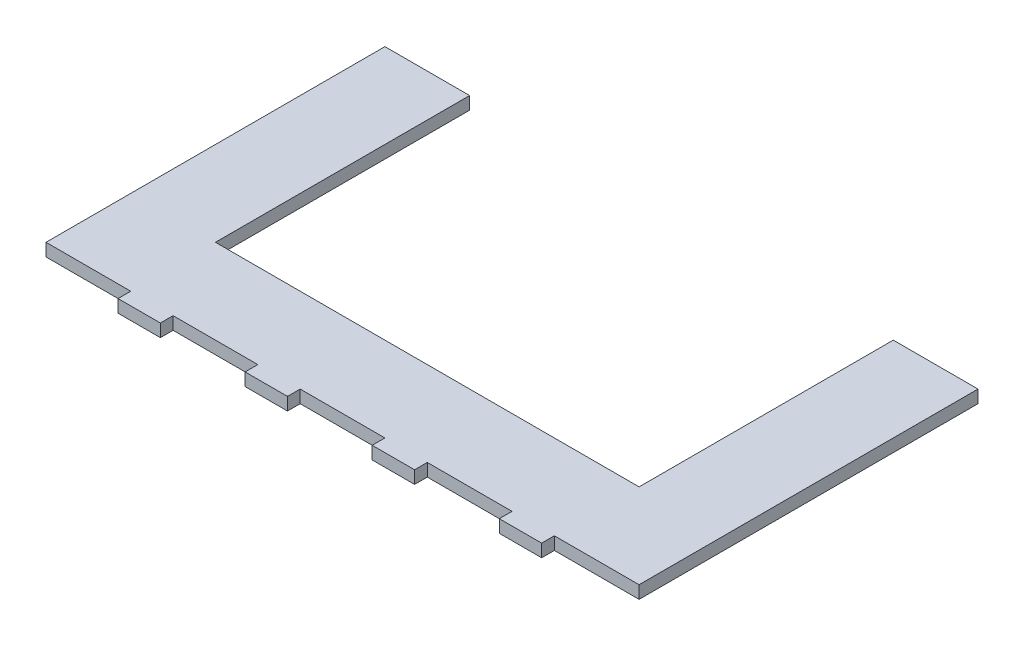
ISO-10303-21;
HEADER;
FILE_DESCRIPTION(('STEP AP214'),'2;1');
FILE_NAME('part.step','',(''),(''),'','','');
FILE_SCHEMA(('AUTOMOTIVE_DESIGN { 1 0 10303 214 1 1 1 1 }'));
ENDSEC;
DATA;
#1=APPLICATION_CONTEXT('core data for automotive mechanical design processes');
#2=APPLICATION_PROTOCOL_DEFINITION('international standard','automotive_design',2000,#1);
#3=PRODUCT_CONTEXT('',#1,'mechanical');
#4=PRODUCT('Part','Part','',(#3));
#5=PRODUCT_RELATED_PRODUCT_CATEGORY('part','',(#4));
#6=PRODUCT_DEFINITION_FORMATION('','',#4);
#7=PRODUCT_DEFINITION_CONTEXT('part definition',#1,'design');
#8=PRODUCT_DEFINITION('design','',#6,#7);
#9=PRODUCT_DEFINITION_SHAPE('','',#8);
#10=(LENGTH_UNIT() NAMED_UNIT(*) SI_UNIT(.MILLI.,.METRE.));
#11=(NAMED_UNIT(*) PLANE_ANGLE_UNIT() SI_UNIT($,.RADIAN.));
#12=(NAMED_UNIT(*) SI_UNIT($,.STERADIAN.) SOLID_ANGLE_UNIT());
#13=UNCERTAINTY_MEASURE_WITH_UNIT(LENGTH_MEASURE(1.E-05),#10,'distance_accuracy_value','');
#14=(GEOMETRIC_REPRESENTATION_CONTEXT(3) GLOBAL_UNCERTAINTY_ASSIGNED_CONTEXT((#13)) GLOBAL_UNIT_ASSIGNED_CONTEXT((#10,
#11,#12)) REPRESENTATION_CONTEXT('',''));
#15=CARTESIAN_POINT('',(0.,0.,0.));
#16=DIRECTION('',(0.,0.,1.));
#17=DIRECTION('',(1.,0.,0.));
#18=AXIS2_PLACEMENT_3D('',#15,#16,#17);
#19=CARTESIAN_POINT('',(-70.,3.,40.));
#20=DIRECTION('',(0.,0.,-1.));
#21=DIRECTION('',(-1.,0.,0.));
#22=AXIS2_PLACEMENT_3D('',#19,#20,#21);
#23=PLANE('',#22);
#24=DIRECTION('',(0.,-1.,0.));
#25=VECTOR('',#24,1.);
#26=CARTESIAN_POINT('',(40.,3.,40.));
#27=LINE('',#26,#25);
#28=CARTESIAN_POINT('',(40.,3.,40.));
#29=VERTEX_POINT('',#28);
#30=CARTESIAN_POINT('',(40.,0.,40.));
#31=VERTEX_POINT('',#30);
#32=EDGE_CURVE('E57',#29,#31,#27,.T.);
#33=ORIENTED_EDGE('',*,*,#32,.F.);
#34=DIRECTION('',(1.,0.,0.));
#35=VECTOR('',#34,1.);
#36=CARTESIAN_POINT('',(-70.,3.,40.));
#37=LINE('',#36,#35);
#38=CARTESIAN_POINT('',(20.,3.,40.));
#39=VERTEX_POINT('',#38);
#40=EDGE_CURVE('E220',#39,#29,#37,.T.);
#41=ORIENTED_EDGE('',*,*,#40,.F.);
#42=DIRECTION('',(0.,1.,0.));
#43=VECTOR('',#42,1.);
#44=CARTESIAN_POINT('',(20.,3.00000000000001,40.));
#45=LINE('',#44,#43);
#46=CARTESIAN_POINT('',(20.,0.,40.));
#47=VERTEX_POINT('',#46);
#48=EDGE_CURVE('E224',#47,#39,#45,.T.);
#49=ORIENTED_EDGE('',*,*,#48,.F.);
#50=DIRECTION('',(1.,0.,0.));
#51=VECTOR('',#50,1.);
#52=CARTESIAN_POINT('',(-70.,0.,40.));
#53=LINE('',#52,#51);
#54=EDGE_CURVE('E377',#47,#31,#53,.T.);
#55=ORIENTED_EDGE('',*,*,#54,.T.);
#56=EDGE_LOOP('',(#33,#41,#49,#55));
#57=FACE_BOUND('',#56,.T.);
#58=ADVANCED_FACE('F34',(#57),#23,.F.);
#59=DIRECTION('',(0.,1.,0.));
#60=VECTOR('',#59,1.);
#61=CARTESIAN_POINT('',(50.,3.00000000000001,40.));
#62=LINE('',#61,#60);
#63=CARTESIAN_POINT('',(50.,0.,40.));
#64=VERTEX_POINT('',#63);
#65=CARTESIAN_POINT('',(50.,3.,40.));
#66=VERTEX_POINT('',#65);
#67=EDGE_CURVE('E215',#64,#66,#62,.T.);
#68=ORIENTED_EDGE('',*,*,#67,.F.);
#69=CARTESIAN_POINT('',(70.,0.,40.));
#70=VERTEX_POINT('',#69);
#71=EDGE_CURVE('E347',#64,#70,#53,.T.);
#72=ORIENTED_EDGE('',*,*,#71,.T.);
#73=DIRECTION('',(0.,-1.,0.));
#74=VECTOR('',#73,1.);
#75=CARTESIAN_POINT('',(70.,3.,40.));
#76=LINE('',#75,#74);
#77=CARTESIAN_POINT('',(70.,3.,40.));
#78=VERTEX_POINT('',#77);
#79=EDGE_CURVE('E337',#78,#70,#76,.T.);
#80=ORIENTED_EDGE('',*,*,#79,.F.);
#81=EDGE_CURVE('E49',#66,#78,#37,.T.);
#82=ORIENTED_EDGE('',*,*,#81,.F.);
#83=EDGE_LOOP('',(#68,#72,#80,#82));
#84=FACE_BOUND('',#83,.T.);
#85=ADVANCED_FACE('F378',(#84),#23,.F.);
#86=DIRECTION('',(0.,-1.,0.));
#87=VECTOR('',#86,1.);
#88=CARTESIAN_POINT('',(9.99999999999999,3.,40.));
#89=LINE('',#88,#87);
#90=CARTESIAN_POINT('',(9.99999999999999,3.,40.));
#91=VERTEX_POINT('',#90);
#92=CARTESIAN_POINT('',(9.99999999999999,0.,40.));
#93=VERTEX_POINT('',#92);
#94=EDGE_CURVE('E221',#91,#93,#89,.T.);
#95=ORIENTED_EDGE('',*,*,#94,.F.);
#96=CARTESIAN_POINT('',(-10.,3.,40.));
#97=VERTEX_POINT('',#96);
#98=EDGE_CURVE('E407',#97,#91,#37,.T.);
#99=ORIENTED_EDGE('',*,*,#98,.F.);
#100=DIRECTION('',(0.,1.,0.));
#101=VECTOR('',#100,1.);
#102=CARTESIAN_POINT('',(-10.,3.00000000000001,40.));
#103=LINE('',#102,#101);
#104=CARTESIAN_POINT('',(-10.,0.,40.));
#105=VERTEX_POINT('',#104);
#106=EDGE_CURVE('E257',#105,#97,#103,.T.);
#107=ORIENTED_EDGE('',*,*,#106,.F.);
#108=EDGE_CURVE('E391',#105,#93,#53,.T.);
#109=ORIENTED_EDGE('',*,*,#108,.T.);
#110=EDGE_LOOP('',(#95,#99,#107,#109));
#111=FACE_BOUND('',#110,.T.);
#112=ADVANCED_FACE('F406',(#111),#23,.F.);
#113=DIRECTION('',(0.,-1.,0.));
#114=VECTOR('',#113,1.);
#115=CARTESIAN_POINT('',(-20.,3.,40.));
#116=LINE('',#115,#114);
#117=CARTESIAN_POINT('',(-20.,3.,40.));
#118=VERTEX_POINT('',#117);
#119=CARTESIAN_POINT('',(-20.,0.,40.));
#120=VERTEX_POINT('',#119);
#121=EDGE_CURVE('E252',#118,#120,#116,.T.);
#122=ORIENTED_EDGE('',*,*,#121,.F.);
#123=CARTESIAN_POINT('',(-40.,3.00000000000001,40.));
#124=VERTEX_POINT('',#123);
#125=EDGE_CURVE('E338',#124,#118,#37,.T.);
#126=ORIENTED_EDGE('',*,*,#125,.F.);
#127=DIRECTION('',(0.,1.,0.));
#128=VECTOR('',#127,1.);
#129=CARTESIAN_POINT('',(-40.,3.00000000000001,40.));
#130=LINE('',#129,#128);
#131=CARTESIAN_POINT('',(-40.,0.,40.));
#132=VERTEX_POINT('',#131);
#133=EDGE_CURVE('E284',#132,#124,#130,.T.);
#134=ORIENTED_EDGE('',*,*,#133,.F.);
#135=EDGE_CURVE('E349',#132,#120,#53,.T.);
#136=ORIENTED_EDGE('',*,*,#135,.T.);
#137=EDGE_LOOP('',(#122,#126,#134,#136));
#138=FACE_BOUND('',#137,.T.);
#139=ADVANCED_FACE('F447',(#138),#23,.F.);
#140=DIRECTION('',(0.,-1.,0.));
#141=VECTOR('',#140,1.);
#142=CARTESIAN_POINT('',(-50.,3.,40.));
#143=LINE('',#142,#141);
#144=CARTESIAN_POINT('',(-50.,3.,40.));
#145=VERTEX_POINT('',#144);
#146=CARTESIAN_POINT('',(-50.,0.,40.));
#147=VERTEX_POINT('',#146);
#148=EDGE_CURVE('E279',#145,#147,#143,.T.);
#149=ORIENTED_EDGE('',*,*,#148,.F.);
#150=CARTESIAN_POINT('',(-70.,3.,40.));
#151=VERTEX_POINT('',#150);
#152=EDGE_CURVE('E334',#151,#145,#37,.T.);
#153=ORIENTED_EDGE('',*,*,#152,.F.);
#154=DIRECTION('',(0.,-1.,0.));
#155=VECTOR('',#154,1.);
#156=CARTESIAN_POINT('',(-70.,3.,40.));
#157=LINE('',#156,#155);
#158=CARTESIAN_POINT('',(-70.,0.,40.));
#159=VERTEX_POINT('',#158);
#160=EDGE_CURVE('E352',#151,#159,#157,.T.);
#161=ORIENTED_EDGE('',*,*,#160,.T.);
#162=EDGE_CURVE('E328',#159,#147,#53,.T.);
#163=ORIENTED_EDGE('',*,*,#162,.T.);
#164=EDGE_LOOP('',(#149,#153,#161,#163));
#165=FACE_BOUND('',#164,.T.);
#166=ADVANCED_FACE('F467',(#165),#23,.F.);
#167=CARTESIAN_POINT('',(-70.,3.,-40.));
#168=DIRECTION('',(0.,0.,1.));
#169=DIRECTION('',(1.,0.,0.));
#170=AXIS2_PLACEMENT_3D('',#167,#168,#169);
#171=PLANE('',#170);
#172=DIRECTION('',(-1.,0.,0.));
#173=VECTOR('',#172,1.);
#174=CARTESIAN_POINT('',(-70.,3.,-40.));
#175=LINE('',#174,#173);
#176=CARTESIAN_POINT('',(-50.,3.,-40.));
#177=VERTEX_POINT('',#176);
#178=CARTESIAN_POINT('',(-70.,3.,-40.));
#179=VERTEX_POINT('',#178);
#180=EDGE_CURVE('E327',#177,#179,#175,.T.);
#181=ORIENTED_EDGE('',*,*,#180,.F.);
#182=DIRECTION('',(0.,1.,0.));
#183=VECTOR('',#182,1.);
#184=CARTESIAN_POINT('',(-50.,-10.,-40.));
#185=LINE('',#184,#183);
#186=CARTESIAN_POINT('',(-50.,0.,-40.));
#187=VERTEX_POINT('',#186);
#188=EDGE_CURVE('E315',#187,#177,#185,.T.);
#189=ORIENTED_EDGE('',*,*,#188,.F.);
#190=DIRECTION('',(-1.,0.,0.));
#191=VECTOR('',#190,1.);
#192=CARTESIAN_POINT('',(-70.,0.,-40.));
#193=LINE('',#192,#191);
#194=CARTESIAN_POINT('',(-70.,0.,-40.));
#195=VERTEX_POINT('',#194);
#196=EDGE_CURVE('E341',#187,#195,#193,.T.);
#197=ORIENTED_EDGE('',*,*,#196,.T.);
#198=DIRECTION('',(0.,-1.,0.));
#199=VECTOR('',#198,1.);
#200=CARTESIAN_POINT('',(-70.,3.,-40.));
#201=LINE('',#200,#199);
#202=EDGE_CURVE('E355',#179,#195,#201,.T.);
#203=ORIENTED_EDGE('',*,*,#202,.F.);
#204=EDGE_LOOP('',(#181,#189,#197,#203));
#205=FACE_BOUND('',#204,.T.);
#206=ADVANCED_FACE('F423',(#205),#171,.F.);
#207=CARTESIAN_POINT('',(70.,3.,-40.));
#208=DIRECTION('',(-1.,0.,0.));
#209=DIRECTION('',(0.,0.,1.));
#210=AXIS2_PLACEMENT_3D('',#207,#208,#209);
#211=PLANE('',#210);
#212=DIRECTION('',(0.,0.,-1.));
#213=VECTOR('',#212,1.);
#214=CARTESIAN_POINT('',(70.,0.,-40.));
#215=LINE('',#214,#213);
#216=CARTESIAN_POINT('',(70.,0.,-40.));
#217=VERTEX_POINT('',#216);
#218=EDGE_CURVE('E317',#70,#217,#215,.T.);
#219=ORIENTED_EDGE('',*,*,#218,.T.);
#220=DIRECTION('',(0.,-1.,0.));
#221=VECTOR('',#220,1.);
#222=CARTESIAN_POINT('',(70.,3.,-40.));
#223=LINE('',#222,#221);
#224=CARTESIAN_POINT('',(70.,3.,-40.));
#225=VERTEX_POINT('',#224);
#226=EDGE_CURVE('E358',#225,#217,#223,.T.);
#227=ORIENTED_EDGE('',*,*,#226,.F.);
#228=DIRECTION('',(0.,0.,-1.));
#229=VECTOR('',#228,1.);
#230=CARTESIAN_POINT('',(70.,3.,-40.));
#231=LINE('',#230,#229);
#232=EDGE_CURVE('E324',#78,#225,#231,.T.);
#233=ORIENTED_EDGE('',*,*,#232,.F.);
#234=ORIENTED_EDGE('',*,*,#79,.T.);
#235=EDGE_LOOP('',(#219,#227,#233,#234));
#236=FACE_BOUND('',#235,.T.);
#237=ADVANCED_FACE('F36',(#236),#211,.F.);
#238=CARTESIAN_POINT('',(50.,0.,-40.));
#239=VERTEX_POINT('',#238);
#240=EDGE_CURVE('E342',#217,#239,#193,.T.);
#241=ORIENTED_EDGE('',*,*,#240,.T.);
#242=DIRECTION('',(0.,1.,0.));
#243=VECTOR('',#242,1.);
#244=CARTESIAN_POINT('',(50.,-10.,-40.));
#245=LINE('',#244,#243);
#246=CARTESIAN_POINT('',(50.,3.,-40.));
#247=VERTEX_POINT('',#246);
#248=EDGE_CURVE('E318',#239,#247,#245,.T.);
#249=ORIENTED_EDGE('',*,*,#248,.T.);
#250=EDGE_CURVE('E329',#225,#247,#175,.T.);
#251=ORIENTED_EDGE('',*,*,#250,.F.);
#252=ORIENTED_EDGE('',*,*,#226,.T.);
#253=EDGE_LOOP('',(#241,#249,#251,#252));
#254=FACE_BOUND('',#253,.T.);
#255=ADVANCED_FACE('F371',(#254),#171,.F.);
#256=CARTESIAN_POINT('',(-70.,3.,-40.));
#257=DIRECTION('',(1.,0.,0.));
#258=DIRECTION('',(0.,0.,-1.));
#259=AXIS2_PLACEMENT_3D('',#256,#257,#258);
#260=PLANE('',#259);
#261=DIRECTION('',(0.,0.,1.));
#262=VECTOR('',#261,1.);
#263=CARTESIAN_POINT('',(-70.,0.,-40.));
#264=LINE('',#263,#262);
#265=EDGE_CURVE('E345',#195,#159,#264,.T.);
#266=ORIENTED_EDGE('',*,*,#265,.T.);
#267=ORIENTED_EDGE('',*,*,#160,.F.);
#268=DIRECTION('',(0.,0.,1.));
#269=VECTOR('',#268,1.);
#270=CARTESIAN_POINT('',(-70.,3.,-40.));
#271=LINE('',#270,#269);
#272=EDGE_CURVE('E332',#179,#151,#271,.T.);
#273=ORIENTED_EDGE('',*,*,#272,.F.);
#274=ORIENTED_EDGE('',*,*,#202,.T.);
#275=EDGE_LOOP('',(#266,#267,#273,#274));
#276=FACE_BOUND('',#275,.T.);
#277=ADVANCED_FACE('F428',(#276),#260,.F.);
#278=CARTESIAN_POINT('',(0.,3.,0.));
#279=DIRECTION('',(0.,1.,0.));
#280=DIRECTION('',(0.,0.,1.));
#281=AXIS2_PLACEMENT_3D('',#278,#279,#280);
#282=PLANE('',#281);
#283=DIRECTION('',(0.,0.,1.));
#284=VECTOR('',#283,1.);
#285=CARTESIAN_POINT('',(-50.,3.,-40.));
#286=LINE('',#285,#284);
#287=CARTESIAN_POINT('',(-50.,3.,20.));
#288=VERTEX_POINT('',#287);
#289=EDGE_CURVE('E306',#177,#288,#286,.T.);
#290=ORIENTED_EDGE('',*,*,#289,.F.);
#291=ORIENTED_EDGE('',*,*,#180,.T.);
#292=ORIENTED_EDGE('',*,*,#272,.T.);
#293=ORIENTED_EDGE('',*,*,#152,.T.);
#294=DIRECTION('',(0.,0.,-1.));
#295=VECTOR('',#294,1.);
#296=CARTESIAN_POINT('',(-50.,3.,43.));
#297=LINE('',#296,#295);
#298=CARTESIAN_POINT('',(-50.,3.,43.));
#299=VERTEX_POINT('',#298);
#300=EDGE_CURVE('E290',#299,#145,#297,.T.);
#301=ORIENTED_EDGE('',*,*,#300,.F.);
#302=DIRECTION('',(-1.,0.,0.));
#303=VECTOR('',#302,1.);
#304=CARTESIAN_POINT('',(-50.,3.,43.));
#305=LINE('',#304,#303);
#306=CARTESIAN_POINT('',(-40.,3.00000000000001,43.));
#307=VERTEX_POINT('',#306);
#308=EDGE_CURVE('E288',#307,#299,#305,.T.);
#309=ORIENTED_EDGE('',*,*,#308,.F.);
#310=DIRECTION('',(0.,0.,-1.));
#311=VECTOR('',#310,1.);
#312=CARTESIAN_POINT('',(-40.,3.00000000000001,43.));
#313=LINE('',#312,#311);
#314=EDGE_CURVE('E297',#307,#124,#313,.T.);
#315=ORIENTED_EDGE('',*,*,#314,.T.);
#316=ORIENTED_EDGE('',*,*,#125,.T.);
#317=DIRECTION('',(0.,0.,-1.));
#318=VECTOR('',#317,1.);
#319=CARTESIAN_POINT('',(-20.,3.,43.));
#320=LINE('',#319,#318);
#321=CARTESIAN_POINT('',(-20.,3.,43.));
#322=VERTEX_POINT('',#321);
#323=EDGE_CURVE('E276',#322,#118,#320,.T.);
#324=ORIENTED_EDGE('',*,*,#323,.F.);
#325=DIRECTION('',(-1.,0.,0.));
#326=VECTOR('',#325,1.);
#327=CARTESIAN_POINT('',(-20.,3.,43.));
#328=LINE('',#327,#326);
#329=CARTESIAN_POINT('',(-10.,3.00000000000001,43.));
#330=VERTEX_POINT('',#329);
#331=EDGE_CURVE('E253',#330,#322,#328,.T.);
#332=ORIENTED_EDGE('',*,*,#331,.F.);
#333=DIRECTION('',(0.,0.,-1.));
#334=VECTOR('',#333,1.);
#335=CARTESIAN_POINT('',(-10.,3.00000000000001,43.));
#336=LINE('',#335,#334);
#337=EDGE_CURVE('E263',#330,#97,#336,.T.);
#338=ORIENTED_EDGE('',*,*,#337,.T.);
#339=ORIENTED_EDGE('',*,*,#98,.T.);
#340=DIRECTION('',(0.,0.,-1.));
#341=VECTOR('',#340,1.);
#342=CARTESIAN_POINT('',(9.99999999999999,3.,43.));
#343=LINE('',#342,#341);
#344=CARTESIAN_POINT('',(9.99999999999999,3.,43.));
#345=VERTEX_POINT('',#344);
#346=EDGE_CURVE('E249',#345,#91,#343,.T.);
#347=ORIENTED_EDGE('',*,*,#346,.F.);
#348=DIRECTION('',(-1.,0.,0.));
#349=VECTOR('',#348,1.);
#350=CARTESIAN_POINT('',(9.99999999999999,3.,43.));
#351=LINE('',#350,#349);
#352=CARTESIAN_POINT('',(20.,3.00000000000001,43.));
#353=VERTEX_POINT('',#352);
#354=EDGE_CURVE('E230',#353,#345,#351,.T.);
#355=ORIENTED_EDGE('',*,*,#354,.F.);
#356=DIRECTION('',(0.,0.,-1.));
#357=VECTOR('',#356,1.);
#358=CARTESIAN_POINT('',(20.,3.00000000000001,43.));
#359=LINE('',#358,#357);
#360=EDGE_CURVE('E238',#353,#39,#359,.T.);
#361=ORIENTED_EDGE('',*,*,#360,.T.);
#362=ORIENTED_EDGE('',*,*,#40,.T.);
#363=DIRECTION('',(0.,0.,-1.));
#364=VECTOR('',#363,1.);
#365=CARTESIAN_POINT('',(40.,3.,43.));
#366=LINE('',#365,#364);
#367=CARTESIAN_POINT('',(40.,3.,43.));
#368=VERTEX_POINT('',#367);
#369=EDGE_CURVE('E200',#368,#29,#366,.T.);
#370=ORIENTED_EDGE('',*,*,#369,.F.);
#371=DIRECTION('',(-1.,0.,0.));
#372=VECTOR('',#371,1.);
#373=CARTESIAN_POINT('',(40.,3.,43.));
#374=LINE('',#373,#372);
#375=CARTESIAN_POINT('',(50.,3.00000000000001,43.));
#376=VERTEX_POINT('',#375);
#377=EDGE_CURVE('E206',#376,#368,#374,.T.);
#378=ORIENTED_EDGE('',*,*,#377,.F.);
#379=DIRECTION('',(0.,0.,-1.));
#380=VECTOR('',#379,1.);
#381=CARTESIAN_POINT('',(50.,3.00000000000001,43.));
#382=LINE('',#381,#380);
#383=EDGE_CURVE('E382',#376,#66,#382,.T.);
#384=ORIENTED_EDGE('',*,*,#383,.T.);
#385=ORIENTED_EDGE('',*,*,#81,.T.);
#386=ORIENTED_EDGE('',*,*,#232,.T.);
#387=ORIENTED_EDGE('',*,*,#250,.T.);
#388=DIRECTION('',(0.,0.,-1.));
#389=VECTOR('',#388,1.);
#390=CARTESIAN_POINT('',(50.,3.,-40.));
#391=LINE('',#390,#389);
#392=CARTESIAN_POINT('',(50.,3.,20.));
#393=VERTEX_POINT('',#392);
#394=EDGE_CURVE('E312',#393,#247,#391,.T.);
#395=ORIENTED_EDGE('',*,*,#394,.F.);
#396=DIRECTION('',(1.,0.,0.));
#397=VECTOR('',#396,1.);
#398=CARTESIAN_POINT('',(-50.,3.,20.));
#399=LINE('',#398,#397);
#400=EDGE_CURVE('E309',#288,#393,#399,.T.);
#401=ORIENTED_EDGE('',*,*,#400,.F.);
#402=EDGE_LOOP('',(#290,#291,#292,#293,#301,#309,#315,#316,#324,#332,#338,#339,#347,#355,#361,
#362,#370,#378,#384,#385,#386,#387,#395,#401));
#403=FACE_BOUND('',#402,.T.);
#404=ADVANCED_FACE('F218',(#403),#282,.T.);
#405=CARTESIAN_POINT('',(0.,0.,0.));
#406=DIRECTION('',(0.,1.,0.));
#407=DIRECTION('',(0.,0.,1.));
#408=AXIS2_PLACEMENT_3D('',#405,#406,#407);
#409=PLANE('',#408);
#410=ORIENTED_EDGE('',*,*,#196,.F.);
#411=DIRECTION('',(0.,0.,1.));
#412=VECTOR('',#411,1.);
#413=CARTESIAN_POINT('',(-50.,0.,0.));
#414=LINE('',#413,#412);
#415=CARTESIAN_POINT('',(-50.,0.,20.));
#416=VERTEX_POINT('',#415);
#417=EDGE_CURVE('E11',#187,#416,#414,.T.);
#418=ORIENTED_EDGE('',*,*,#417,.T.);
#419=DIRECTION('',(1.,0.,0.));
#420=VECTOR('',#419,1.);
#421=CARTESIAN_POINT('',(0.,0.,20.));
#422=LINE('',#421,#420);
#423=CARTESIAN_POINT('',(50.,0.,20.));
#424=VERTEX_POINT('',#423);
#425=EDGE_CURVE('E361',#416,#424,#422,.T.);
#426=ORIENTED_EDGE('',*,*,#425,.T.);
#427=DIRECTION('',(0.,0.,-1.));
#428=VECTOR('',#427,1.);
#429=CARTESIAN_POINT('',(50.,0.,0.));
#430=LINE('',#429,#428);
#431=EDGE_CURVE('E42',#424,#239,#430,.T.);
#432=ORIENTED_EDGE('',*,*,#431,.T.);
#433=ORIENTED_EDGE('',*,*,#240,.F.);
#434=ORIENTED_EDGE('',*,*,#218,.F.);
#435=ORIENTED_EDGE('',*,*,#71,.F.);
#436=DIRECTION('',(0.,0.,-1.));
#437=VECTOR('',#436,1.);
#438=CARTESIAN_POINT('',(50.,0.,43.));
#439=LINE('',#438,#437);
#440=CARTESIAN_POINT('',(50.,0.,43.));
#441=VERTEX_POINT('',#440);
#442=EDGE_CURVE('E226',#441,#64,#439,.T.);
#443=ORIENTED_EDGE('',*,*,#442,.F.);
#444=DIRECTION('',(1.,0.,0.));
#445=VECTOR('',#444,1.);
#446=CARTESIAN_POINT('',(40.,0.,43.));
#447=LINE('',#446,#445);
#448=CARTESIAN_POINT('',(40.,0.,43.));
#449=VERTEX_POINT('',#448);
#450=EDGE_CURVE('E205',#449,#441,#447,.T.);
#451=ORIENTED_EDGE('',*,*,#450,.F.);
#452=DIRECTION('',(0.,0.,-1.));
#453=VECTOR('',#452,1.);
#454=CARTESIAN_POINT('',(40.,0.,43.));
#455=LINE('',#454,#453);
#456=EDGE_CURVE('E202',#449,#31,#455,.T.);
#457=ORIENTED_EDGE('',*,*,#456,.T.);
#458=ORIENTED_EDGE('',*,*,#54,.F.);
#459=DIRECTION('',(0.,0.,-1.));
#460=VECTOR('',#459,1.);
#461=CARTESIAN_POINT('',(20.,0.,43.));
#462=LINE('',#461,#460);
#463=CARTESIAN_POINT('',(20.,0.,43.));
#464=VERTEX_POINT('',#463);
#465=EDGE_CURVE('E243',#464,#47,#462,.T.);
#466=ORIENTED_EDGE('',*,*,#465,.F.);
#467=DIRECTION('',(1.,0.,0.));
#468=VECTOR('',#467,1.);
#469=CARTESIAN_POINT('',(9.99999999999999,0.,43.));
#470=LINE('',#469,#468);
#471=CARTESIAN_POINT('',(9.99999999999999,0.,43.));
#472=VERTEX_POINT('',#471);
#473=EDGE_CURVE('E235',#472,#464,#470,.T.);
#474=ORIENTED_EDGE('',*,*,#473,.F.);
#475=DIRECTION('',(0.,0.,-1.));
#476=VECTOR('',#475,1.);
#477=CARTESIAN_POINT('',(9.99999999999999,0.,43.));
#478=LINE('',#477,#476);
#479=EDGE_CURVE('E246',#472,#93,#478,.T.);
#480=ORIENTED_EDGE('',*,*,#479,.T.);
#481=ORIENTED_EDGE('',*,*,#108,.F.);
#482=DIRECTION('',(0.,0.,-1.));
#483=VECTOR('',#482,1.);
#484=CARTESIAN_POINT('',(-10.,0.,43.));
#485=LINE('',#484,#483);
#486=CARTESIAN_POINT('',(-10.,0.,43.));
#487=VERTEX_POINT('',#486);
#488=EDGE_CURVE('E270',#487,#105,#485,.T.);
#489=ORIENTED_EDGE('',*,*,#488,.F.);
#490=DIRECTION('',(1.,0.,0.));
#491=VECTOR('',#490,1.);
#492=CARTESIAN_POINT('',(-20.,0.,43.));
#493=LINE('',#492,#491);
#494=CARTESIAN_POINT('',(-20.,0.,43.));
#495=VERTEX_POINT('',#494);
#496=EDGE_CURVE('E259',#495,#487,#493,.T.);
#497=ORIENTED_EDGE('',*,*,#496,.F.);
#498=DIRECTION('',(0.,0.,-1.));
#499=VECTOR('',#498,1.);
#500=CARTESIAN_POINT('',(-20.,0.,43.));
#501=LINE('',#500,#499);
#502=EDGE_CURVE('E273',#495,#120,#501,.T.);
#503=ORIENTED_EDGE('',*,*,#502,.T.);
#504=ORIENTED_EDGE('',*,*,#135,.F.);
#505=DIRECTION('',(0.,0.,-1.));
#506=VECTOR('',#505,1.);
#507=CARTESIAN_POINT('',(-40.,0.,43.));
#508=LINE('',#507,#506);
#509=CARTESIAN_POINT('',(-40.,0.,43.));
#510=VERTEX_POINT('',#509);
#511=EDGE_CURVE('E300',#510,#132,#508,.T.);
#512=ORIENTED_EDGE('',*,*,#511,.F.);
#513=DIRECTION('',(1.,0.,0.));
#514=VECTOR('',#513,1.);
#515=CARTESIAN_POINT('',(-50.,0.,43.));
#516=LINE('',#515,#514);
#517=CARTESIAN_POINT('',(-50.,0.,43.));
#518=VERTEX_POINT('',#517);
#519=EDGE_CURVE('E283',#518,#510,#516,.T.);
#520=ORIENTED_EDGE('',*,*,#519,.F.);
#521=DIRECTION('',(0.,0.,-1.));
#522=VECTOR('',#521,1.);
#523=CARTESIAN_POINT('',(-50.,0.,43.));
#524=LINE('',#523,#522);
#525=EDGE_CURVE('E303',#518,#147,#524,.T.);
#526=ORIENTED_EDGE('',*,*,#525,.T.);
#527=ORIENTED_EDGE('',*,*,#162,.F.);
#528=ORIENTED_EDGE('',*,*,#265,.F.);
#529=EDGE_LOOP('',(#410,#418,#426,#432,#433,#434,#435,#443,#451,#457,#458,#466,#474,#480,#481,
#489,#497,#503,#504,#512,#520,#526,#527,#528));
#530=FACE_BOUND('',#529,.T.);
#531=ADVANCED_FACE('F367',(#530),#409,.F.);
#532=CARTESIAN_POINT('',(-50.,-10.,-40.));
#533=DIRECTION('',(-1.,0.,0.));
#534=DIRECTION('',(0.,0.,1.));
#535=AXIS2_PLACEMENT_3D('',#532,#533,#534);
#536=PLANE('',#535);
#537=ORIENTED_EDGE('',*,*,#188,.T.);
#538=ORIENTED_EDGE('',*,*,#289,.T.);
#539=DIRECTION('',(0.,1.,0.));
#540=VECTOR('',#539,1.);
#541=CARTESIAN_POINT('',(-50.,-10.,20.));
#542=LINE('',#541,#540);
#543=EDGE_CURVE('E314',#416,#288,#542,.T.);
#544=ORIENTED_EDGE('',*,*,#543,.F.);
#545=ORIENTED_EDGE('',*,*,#417,.F.);
#546=EDGE_LOOP('',(#537,#538,#544,#545));
#547=FACE_BOUND('',#546,.T.);
#548=ADVANCED_FACE('F418',(#547),#536,.F.);
#549=CARTESIAN_POINT('',(50.,-10.,-40.));
#550=DIRECTION('',(1.,0.,0.));
#551=DIRECTION('',(0.,0.,-1.));
#552=AXIS2_PLACEMENT_3D('',#549,#550,#551);
#553=PLANE('',#552);
#554=DIRECTION('',(0.,1.,0.));
#555=VECTOR('',#554,1.);
#556=CARTESIAN_POINT('',(50.,-10.,20.));
#557=LINE('',#556,#555);
#558=EDGE_CURVE('E321',#424,#393,#557,.T.);
#559=ORIENTED_EDGE('',*,*,#558,.T.);
#560=ORIENTED_EDGE('',*,*,#394,.T.);
#561=ORIENTED_EDGE('',*,*,#248,.F.);
#562=ORIENTED_EDGE('',*,*,#431,.F.);
#563=EDGE_LOOP('',(#559,#560,#561,#562));
#564=FACE_BOUND('',#563,.T.);
#565=ADVANCED_FACE('F413',(#564),#553,.F.);
#566=CARTESIAN_POINT('',(-50.,-10.,20.));
#567=DIRECTION('',(0.,0.,1.));
#568=DIRECTION('',(1.,0.,0.));
#569=AXIS2_PLACEMENT_3D('',#566,#567,#568);
#570=PLANE('',#569);
#571=ORIENTED_EDGE('',*,*,#543,.T.);
#572=ORIENTED_EDGE('',*,*,#400,.T.);
#573=ORIENTED_EDGE('',*,*,#558,.F.);
#574=ORIENTED_EDGE('',*,*,#425,.F.);
#575=EDGE_LOOP('',(#571,#572,#573,#574));
#576=FACE_BOUND('',#575,.T.);
#577=ADVANCED_FACE('F415',(#576),#570,.F.);
#578=CARTESIAN_POINT('',(-50.,3.,43.));
#579=DIRECTION('',(1.,0.,0.));
#580=DIRECTION('',(0.,0.,-1.));
#581=AXIS2_PLACEMENT_3D('',#578,#579,#580);
#582=PLANE('',#581);
#583=ORIENTED_EDGE('',*,*,#148,.T.);
#584=ORIENTED_EDGE('',*,*,#525,.F.);
#585=DIRECTION('',(0.,-1.,0.));
#586=VECTOR('',#585,1.);
#587=CARTESIAN_POINT('',(-50.,3.,43.));
#588=LINE('',#587,#586);
#589=EDGE_CURVE('E280',#299,#518,#588,.T.);
#590=ORIENTED_EDGE('',*,*,#589,.F.);
#591=ORIENTED_EDGE('',*,*,#300,.T.);
#592=EDGE_LOOP('',(#583,#584,#590,#591));
#593=FACE_BOUND('',#592,.T.);
#594=ADVANCED_FACE('F435',(#593),#582,.F.);
#595=CARTESIAN_POINT('',(-40.,3.00000000000001,43.));
#596=DIRECTION('',(-1.,0.,0.));
#597=DIRECTION('',(0.,0.,1.));
#598=AXIS2_PLACEMENT_3D('',#595,#596,#597);
#599=PLANE('',#598);
#600=ORIENTED_EDGE('',*,*,#133,.T.);
#601=ORIENTED_EDGE('',*,*,#314,.F.);
#602=DIRECTION('',(0.,1.,0.));
#603=VECTOR('',#602,1.);
#604=CARTESIAN_POINT('',(-40.,3.00000000000001,43.));
#605=LINE('',#604,#603);
#606=EDGE_CURVE('E286',#510,#307,#605,.T.);
#607=ORIENTED_EDGE('',*,*,#606,.F.);
#608=ORIENTED_EDGE('',*,*,#511,.T.);
#609=EDGE_LOOP('',(#600,#601,#607,#608));
#610=FACE_BOUND('',#609,.T.);
#611=ADVANCED_FACE('F444',(#610),#599,.F.);
#612=CARTESIAN_POINT('',(0.,0.,43.));
#613=DIRECTION('',(0.,0.,1.));
#614=DIRECTION('',(1.,0.,0.));
#615=AXIS2_PLACEMENT_3D('',#612,#613,#614);
#616=PLANE('',#615);
#617=ORIENTED_EDGE('',*,*,#589,.T.);
#618=ORIENTED_EDGE('',*,*,#519,.T.);
#619=ORIENTED_EDGE('',*,*,#606,.T.);
#620=ORIENTED_EDGE('',*,*,#308,.T.);
#621=EDGE_LOOP('',(#617,#618,#619,#620));
#622=FACE_BOUND('',#621,.T.);
#623=ADVANCED_FACE('F438',(#622),#616,.T.);
#624=CARTESIAN_POINT('',(-20.,3.,43.));
#625=DIRECTION('',(1.,0.,0.));
#626=DIRECTION('',(0.,0.,-1.));
#627=AXIS2_PLACEMENT_3D('',#624,#625,#626);
#628=PLANE('',#627);
#629=ORIENTED_EDGE('',*,*,#121,.T.);
#630=ORIENTED_EDGE('',*,*,#502,.F.);
#631=DIRECTION('',(0.,-1.,0.));
#632=VECTOR('',#631,1.);
#633=CARTESIAN_POINT('',(-20.,3.,43.));
#634=LINE('',#633,#632);
#635=EDGE_CURVE('E256',#322,#495,#634,.T.);
#636=ORIENTED_EDGE('',*,*,#635,.F.);
#637=ORIENTED_EDGE('',*,*,#323,.T.);
#638=EDGE_LOOP('',(#629,#630,#636,#637));
#639=FACE_BOUND('',#638,.T.);
#640=ADVANCED_FACE('F451',(#639),#628,.F.);
#641=CARTESIAN_POINT('',(-10.,3.00000000000001,43.));
#642=DIRECTION('',(-1.,0.,0.));
#643=DIRECTION('',(0.,0.,1.));
#644=AXIS2_PLACEMENT_3D('',#641,#642,#643);
#645=PLANE('',#644);
#646=ORIENTED_EDGE('',*,*,#106,.T.);
#647=ORIENTED_EDGE('',*,*,#337,.F.);
#648=DIRECTION('',(0.,1.,0.));
#649=VECTOR('',#648,1.);
#650=CARTESIAN_POINT('',(-10.,3.00000000000001,43.));
#651=LINE('',#650,#649);
#652=EDGE_CURVE('E261',#487,#330,#651,.T.);
#653=ORIENTED_EDGE('',*,*,#652,.F.);
#654=ORIENTED_EDGE('',*,*,#488,.T.);
#655=EDGE_LOOP('',(#646,#647,#653,#654));
#656=FACE_BOUND('',#655,.T.);
#657=ADVANCED_FACE('F456',(#656),#645,.F.);
#658=CARTESIAN_POINT('',(0.,0.,43.));
#659=DIRECTION('',(0.,0.,-1.));
#660=DIRECTION('',(-1.,0.,0.));
#661=AXIS2_PLACEMENT_3D('',#658,#659,#660);
#662=PLANE('',#661);
#663=ORIENTED_EDGE('',*,*,#331,.T.);
#664=ORIENTED_EDGE('',*,*,#635,.T.);
#665=ORIENTED_EDGE('',*,*,#496,.T.);
#666=ORIENTED_EDGE('',*,*,#652,.T.);
#667=EDGE_LOOP('',(#663,#664,#665,#666));
#668=FACE_BOUND('',#667,.T.);
#669=ADVANCED_FACE('F453',(#668),#662,.F.);
#670=CARTESIAN_POINT('',(9.99999999999999,3.,43.));
#671=DIRECTION('',(1.,0.,0.));
#672=DIRECTION('',(0.,0.,-1.));
#673=AXIS2_PLACEMENT_3D('',#670,#671,#672);
#674=PLANE('',#673);
#675=ORIENTED_EDGE('',*,*,#94,.T.);
#676=ORIENTED_EDGE('',*,*,#479,.F.);
#677=DIRECTION('',(0.,-1.,0.));
#678=VECTOR('',#677,1.);
#679=CARTESIAN_POINT('',(9.99999999999999,3.,43.));
#680=LINE('',#679,#678);
#681=EDGE_CURVE('E233',#345,#472,#680,.T.);
#682=ORIENTED_EDGE('',*,*,#681,.F.);
#683=ORIENTED_EDGE('',*,*,#346,.T.);
#684=EDGE_LOOP('',(#675,#676,#682,#683));
#685=FACE_BOUND('',#684,.T.);
#686=ADVANCED_FACE('F403',(#685),#674,.F.);
#687=CARTESIAN_POINT('',(20.,3.00000000000001,43.));
#688=DIRECTION('',(-1.,0.,0.));
#689=DIRECTION('',(0.,0.,1.));
#690=AXIS2_PLACEMENT_3D('',#687,#688,#689);
#691=PLANE('',#690);
#692=ORIENTED_EDGE('',*,*,#48,.T.);
#693=ORIENTED_EDGE('',*,*,#360,.F.);
#694=DIRECTION('',(0.,1.,0.));
#695=VECTOR('',#694,1.);
#696=CARTESIAN_POINT('',(20.,3.00000000000001,43.));
#697=LINE('',#696,#695);
#698=EDGE_CURVE('E237',#464,#353,#697,.T.);
#699=ORIENTED_EDGE('',*,*,#698,.F.);
#700=ORIENTED_EDGE('',*,*,#465,.T.);
#701=EDGE_LOOP('',(#692,#693,#699,#700));
#702=FACE_BOUND('',#701,.T.);
#703=ADVANCED_FACE('F394',(#702),#691,.F.);
#704=CARTESIAN_POINT('',(0.,0.,43.));
#705=DIRECTION('',(0.,0.,-1.));
#706=DIRECTION('',(-1.,0.,0.));
#707=AXIS2_PLACEMENT_3D('',#704,#705,#706);
#708=PLANE('',#707);
#709=ORIENTED_EDGE('',*,*,#354,.T.);
#710=ORIENTED_EDGE('',*,*,#681,.T.);
#711=ORIENTED_EDGE('',*,*,#473,.T.);
#712=ORIENTED_EDGE('',*,*,#698,.T.);
#713=EDGE_LOOP('',(#709,#710,#711,#712));
#714=FACE_BOUND('',#713,.T.);
#715=ADVANCED_FACE('F397',(#714),#708,.F.);
#716=CARTESIAN_POINT('',(40.,3.,43.));
#717=DIRECTION('',(1.,0.,0.));
#718=DIRECTION('',(0.,0.,-1.));
#719=AXIS2_PLACEMENT_3D('',#716,#717,#718);
#720=PLANE('',#719);
#721=ORIENTED_EDGE('',*,*,#32,.T.);
#722=ORIENTED_EDGE('',*,*,#456,.F.);
#723=DIRECTION('',(0.,-1.,0.));
#724=VECTOR('',#723,1.);
#725=CARTESIAN_POINT('',(40.,3.,43.));
#726=LINE('',#725,#724);
#727=EDGE_CURVE('E196',#368,#449,#726,.T.);
#728=ORIENTED_EDGE('',*,*,#727,.F.);
#729=ORIENTED_EDGE('',*,*,#369,.T.);
#730=EDGE_LOOP('',(#721,#722,#728,#729));
#731=FACE_BOUND('',#730,.T.);
#732=ADVANCED_FACE('F198',(#731),#720,.F.);
#733=CARTESIAN_POINT('',(50.,3.00000000000001,43.));
#734=DIRECTION('',(-1.,0.,0.));
#735=DIRECTION('',(0.,0.,1.));
#736=AXIS2_PLACEMENT_3D('',#733,#734,#735);
#737=PLANE('',#736);
#738=ORIENTED_EDGE('',*,*,#67,.T.);
#739=ORIENTED_EDGE('',*,*,#383,.F.);
#740=DIRECTION('',(0.,1.,0.));
#741=VECTOR('',#740,1.);
#742=CARTESIAN_POINT('',(50.,3.00000000000001,43.));
#743=LINE('',#742,#741);
#744=EDGE_CURVE('E211',#441,#376,#743,.T.);
#745=ORIENTED_EDGE('',*,*,#744,.F.);
#746=ORIENTED_EDGE('',*,*,#442,.T.);
#747=EDGE_LOOP('',(#738,#739,#745,#746));
#748=FACE_BOUND('',#747,.T.);
#749=ADVANCED_FACE('F381',(#748),#737,.F.);
#750=CARTESIAN_POINT('',(0.,0.,43.));
#751=DIRECTION('',(0.,0.,-1.));
#752=DIRECTION('',(-1.,0.,0.));
#753=AXIS2_PLACEMENT_3D('',#750,#751,#752);
#754=PLANE('',#753);
#755=ORIENTED_EDGE('',*,*,#377,.T.);
#756=ORIENTED_EDGE('',*,*,#727,.T.);
#757=ORIENTED_EDGE('',*,*,#450,.T.);
#758=ORIENTED_EDGE('',*,*,#744,.T.);
#759=EDGE_LOOP('',(#755,#756,#757,#758));
#760=FACE_BOUND('',#759,.T.);
#761=ADVANCED_FACE('F209',(#760),#754,.F.);
#762=CLOSED_SHELL('',(#58,#85,#112,#139,#166,#206,#237,#255,#277,#404,#531,#548,#565,#577,#594,
#611,#623,#640,#657,#669,#686,#703,#715,#732,#749,#761));
#763=MANIFOLD_SOLID_BREP('B2',#762);
#764=ADVANCED_BREP_SHAPE_REPRESENTATION('',(#18,#763),#14);
#765=SHAPE_DEFINITION_REPRESENTATION(#9,#764);
ENDSEC;
END-ISO-10303-21;
